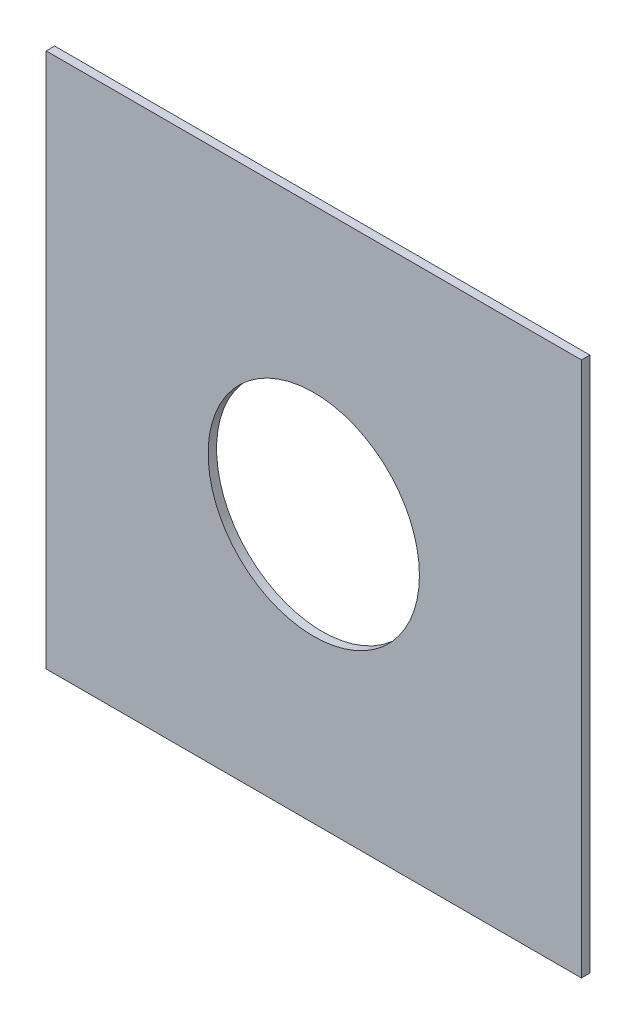
ISO-10303-21;
HEADER;
FILE_DESCRIPTION(('STEP AP214'),'2;1');
FILE_NAME('part.step','',(''),(''),'','','');
FILE_SCHEMA(('AUTOMOTIVE_DESIGN { 1 0 10303 214 1 1 1 1 }'));
ENDSEC;
DATA;
#1=APPLICATION_CONTEXT('core data for automotive mechanical design processes');
#2=APPLICATION_PROTOCOL_DEFINITION('international standard','automotive_design',2000,#1);
#3=PRODUCT_CONTEXT('',#1,'mechanical');
#4=PRODUCT('Part','Part','',(#3));
#5=PRODUCT_RELATED_PRODUCT_CATEGORY('part','',(#4));
#6=PRODUCT_DEFINITION_FORMATION('','',#4);
#7=PRODUCT_DEFINITION_CONTEXT('part definition',#1,'design');
#8=PRODUCT_DEFINITION('design','',#6,#7);
#9=PRODUCT_DEFINITION_SHAPE('','',#8);
#10=(LENGTH_UNIT() NAMED_UNIT(*) SI_UNIT(.MILLI.,.METRE.));
#11=(NAMED_UNIT(*) PLANE_ANGLE_UNIT() SI_UNIT($,.RADIAN.));
#12=(NAMED_UNIT(*) SI_UNIT($,.STERADIAN.) SOLID_ANGLE_UNIT());
#13=UNCERTAINTY_MEASURE_WITH_UNIT(LENGTH_MEASURE(1.E-05),#10,'distance_accuracy_value','');
#14=(GEOMETRIC_REPRESENTATION_CONTEXT(3) GLOBAL_UNCERTAINTY_ASSIGNED_CONTEXT((#13)) GLOBAL_UNIT_ASSIGNED_CONTEXT((#10,
#11,#12)) REPRESENTATION_CONTEXT('',''));
#15=CARTESIAN_POINT('',(0.,0.,0.));
#16=DIRECTION('',(0.,0.,1.));
#17=DIRECTION('',(1.,0.,0.));
#18=AXIS2_PLACEMENT_3D('',#15,#16,#17);
#19=CARTESIAN_POINT('',(95.,-95.,-3.));
#20=DIRECTION('',(1.,0.,0.));
#21=DIRECTION('',(0.,0.,-1.));
#22=AXIS2_PLACEMENT_3D('',#19,#20,#21);
#23=PLANE('',#22);
#24=DIRECTION('',(0.,1.,0.));
#25=VECTOR('',#24,1.);
#26=CARTESIAN_POINT('',(95.,-95.,0.));
#27=LINE('',#26,#25);
#28=CARTESIAN_POINT('',(95.,-95.,0.));
#29=VERTEX_POINT('',#28);
#30=CARTESIAN_POINT('',(95.,95.,0.));
#31=VERTEX_POINT('',#30);
#32=EDGE_CURVE('E102',#29,#31,#27,.T.);
#33=ORIENTED_EDGE('',*,*,#32,.F.);
#34=DIRECTION('',(0.,0.,1.));
#35=VECTOR('',#34,1.);
#36=CARTESIAN_POINT('',(95.,-95.,-3.));
#37=LINE('',#36,#35);
#38=CARTESIAN_POINT('',(95.,-95.,-3.));
#39=VERTEX_POINT('',#38);
#40=EDGE_CURVE('E11',#39,#29,#37,.T.);
#41=ORIENTED_EDGE('',*,*,#40,.F.);
#42=DIRECTION('',(0.,1.,0.));
#43=VECTOR('',#42,1.);
#44=CARTESIAN_POINT('',(95.,-95.,-3.));
#45=LINE('',#44,#43);
#46=CARTESIAN_POINT('',(95.,95.,-3.));
#47=VERTEX_POINT('',#46);
#48=EDGE_CURVE('E95',#39,#47,#45,.T.);
#49=ORIENTED_EDGE('',*,*,#48,.T.);
#50=DIRECTION('',(0.,0.,1.));
#51=VECTOR('',#50,1.);
#52=CARTESIAN_POINT('',(95.,95.,-3.));
#53=LINE('',#52,#51);
#54=EDGE_CURVE('E40',#47,#31,#53,.T.);
#55=ORIENTED_EDGE('',*,*,#54,.T.);
#56=EDGE_LOOP('',(#33,#41,#49,#55));
#57=FACE_BOUND('',#56,.T.);
#58=ADVANCED_FACE('F37',(#57),#23,.T.);
#59=CARTESIAN_POINT('',(-95.,-95.,-3.));
#60=DIRECTION('',(0.,-1.,0.));
#61=DIRECTION('',(0.,0.,-1.));
#62=AXIS2_PLACEMENT_3D('',#59,#60,#61);
#63=PLANE('',#62);
#64=DIRECTION('',(1.,0.,0.));
#65=VECTOR('',#64,1.);
#66=CARTESIAN_POINT('',(-95.,-95.,0.));
#67=LINE('',#66,#65);
#68=CARTESIAN_POINT('',(-95.,-95.,0.));
#69=VERTEX_POINT('',#68);
#70=EDGE_CURVE('E97',#69,#29,#67,.T.);
#71=ORIENTED_EDGE('',*,*,#70,.F.);
#72=DIRECTION('',(0.,0.,1.));
#73=VECTOR('',#72,1.);
#74=CARTESIAN_POINT('',(-95.,-95.,-3.));
#75=LINE('',#74,#73);
#76=CARTESIAN_POINT('',(-95.,-95.,-3.));
#77=VERTEX_POINT('',#76);
#78=EDGE_CURVE('E46',#77,#69,#75,.T.);
#79=ORIENTED_EDGE('',*,*,#78,.F.);
#80=DIRECTION('',(1.,0.,0.));
#81=VECTOR('',#80,1.);
#82=CARTESIAN_POINT('',(-95.,-95.,-3.));
#83=LINE('',#82,#81);
#84=EDGE_CURVE('E92',#77,#39,#83,.T.);
#85=ORIENTED_EDGE('',*,*,#84,.T.);
#86=ORIENTED_EDGE('',*,*,#40,.T.);
#87=EDGE_LOOP('',(#71,#79,#85,#86));
#88=FACE_BOUND('',#87,.T.);
#89=ADVANCED_FACE('F113',(#88),#63,.T.);
#90=CARTESIAN_POINT('',(-95.,-95.,-3.));
#91=DIRECTION('',(-1.,0.,0.));
#92=DIRECTION('',(0.,0.,1.));
#93=AXIS2_PLACEMENT_3D('',#90,#91,#92);
#94=PLANE('',#93);
#95=DIRECTION('',(0.,-1.,0.));
#96=VECTOR('',#95,1.);
#97=CARTESIAN_POINT('',(-95.,-95.,0.));
#98=LINE('',#97,#96);
#99=CARTESIAN_POINT('',(-95.,95.,0.));
#100=VERTEX_POINT('',#99);
#101=EDGE_CURVE('E87',#100,#69,#98,.T.);
#102=ORIENTED_EDGE('',*,*,#101,.F.);
#103=DIRECTION('',(0.,0.,1.));
#104=VECTOR('',#103,1.);
#105=CARTESIAN_POINT('',(-95.,95.,-3.));
#106=LINE('',#105,#104);
#107=CARTESIAN_POINT('',(-95.,95.,-3.));
#108=VERTEX_POINT('',#107);
#109=EDGE_CURVE('E82',#108,#100,#106,.T.);
#110=ORIENTED_EDGE('',*,*,#109,.F.);
#111=DIRECTION('',(0.,-1.,0.));
#112=VECTOR('',#111,1.);
#113=CARTESIAN_POINT('',(-95.,-95.,-3.));
#114=LINE('',#113,#112);
#115=EDGE_CURVE('E85',#108,#77,#114,.T.);
#116=ORIENTED_EDGE('',*,*,#115,.T.);
#117=ORIENTED_EDGE('',*,*,#78,.T.);
#118=EDGE_LOOP('',(#102,#110,#116,#117));
#119=FACE_BOUND('',#118,.T.);
#120=ADVANCED_FACE('F84',(#119),#94,.T.);
#121=CARTESIAN_POINT('',(-95.,95.,-3.));
#122=DIRECTION('',(0.,1.,0.));
#123=DIRECTION('',(0.,0.,1.));
#124=AXIS2_PLACEMENT_3D('',#121,#122,#123);
#125=PLANE('',#124);
#126=DIRECTION('',(-1.,0.,0.));
#127=VECTOR('',#126,1.);
#128=CARTESIAN_POINT('',(-95.,95.,0.));
#129=LINE('',#128,#127);
#130=EDGE_CURVE('E105',#31,#100,#129,.T.);
#131=ORIENTED_EDGE('',*,*,#130,.F.);
#132=ORIENTED_EDGE('',*,*,#54,.F.);
#133=DIRECTION('',(-1.,0.,0.));
#134=VECTOR('',#133,1.);
#135=CARTESIAN_POINT('',(-95.,95.,-3.));
#136=LINE('',#135,#134);
#137=EDGE_CURVE('E91',#47,#108,#136,.T.);
#138=ORIENTED_EDGE('',*,*,#137,.T.);
#139=ORIENTED_EDGE('',*,*,#109,.T.);
#140=EDGE_LOOP('',(#131,#132,#138,#139));
#141=FACE_BOUND('',#140,.T.);
#142=ADVANCED_FACE('F94',(#141),#125,.T.);
#143=CARTESIAN_POINT('',(0.,0.,-3.));
#144=DIRECTION('',(0.,0.,-1.));
#145=DIRECTION('',(-1.,0.,0.));
#146=AXIS2_PLACEMENT_3D('',#143,#144,#145);
#147=PLANE('',#146);
#148=CARTESIAN_POINT('',(6.93889390390723E-13,-5.27355936696949E-13,-3.));
#149=DIRECTION('',(0.,0.,1.));
#150=DIRECTION('',(1.,0.,0.));
#151=AXIS2_PLACEMENT_3D('',#148,#149,#150);
#152=CIRCLE('',#151,37.5);
#153=CARTESIAN_POINT('',(37.5000000000007,-5.27355936696949E-13,-3.));
#154=VERTEX_POINT('',#153);
#155=EDGE_CURVE('E106',#154,#154,#152,.T.);
#156=ORIENTED_EDGE('',*,*,#155,.T.);
#157=EDGE_LOOP('',(#156));
#158=FACE_BOUND('',#157,.T.);
#159=ORIENTED_EDGE('',*,*,#48,.F.);
#160=ORIENTED_EDGE('',*,*,#84,.F.);
#161=ORIENTED_EDGE('',*,*,#115,.F.);
#162=ORIENTED_EDGE('',*,*,#137,.F.);
#163=EDGE_LOOP('',(#159,#160,#161,#162));
#164=FACE_BOUND('',#163,.T.);
#165=ADVANCED_FACE('F90',(#158,#164),#147,.T.);
#166=CARTESIAN_POINT('',(0.,0.,0.));
#167=DIRECTION('',(0.,0.,-1.));
#168=DIRECTION('',(-1.,0.,0.));
#169=AXIS2_PLACEMENT_3D('',#166,#167,#168);
#170=PLANE('',#169);
#171=CARTESIAN_POINT('',(6.93889390390723E-13,-5.27355936696949E-13,0.));
#172=DIRECTION('',(0.,0.,1.));
#173=DIRECTION('',(1.,0.,0.));
#174=AXIS2_PLACEMENT_3D('',#171,#172,#173);
#175=CIRCLE('',#174,37.5);
#176=CARTESIAN_POINT('',(37.5000000000007,-5.27355936696949E-13,0.));
#177=VERTEX_POINT('',#176);
#178=EDGE_CURVE('E143',#177,#177,#175,.T.);
#179=ORIENTED_EDGE('',*,*,#178,.F.);
#180=EDGE_LOOP('',(#179));
#181=FACE_BOUND('',#180,.T.);
#182=ORIENTED_EDGE('',*,*,#32,.T.);
#183=ORIENTED_EDGE('',*,*,#130,.T.);
#184=ORIENTED_EDGE('',*,*,#101,.T.);
#185=ORIENTED_EDGE('',*,*,#70,.T.);
#186=EDGE_LOOP('',(#182,#183,#184,#185));
#187=FACE_BOUND('',#186,.T.);
#188=ADVANCED_FACE('F112',(#181,#187),#170,.F.);
#189=CARTESIAN_POINT('',(6.93889390390723E-13,-5.27355936696949E-13,-3.));
#190=DIRECTION('',(0.,0.,1.));
#191=DIRECTION('',(1.,0.,0.));
#192=AXIS2_PLACEMENT_3D('',#189,#190,#191);
#193=CYLINDRICAL_SURFACE('',#192,37.5);
#194=ORIENTED_EDGE('',*,*,#155,.F.);
#195=EDGE_LOOP('',(#194));
#196=FACE_BOUND('',#195,.T.);
#197=ORIENTED_EDGE('',*,*,#178,.T.);
#198=EDGE_LOOP('',(#197));
#199=FACE_BOUND('',#198,.T.);
#200=ADVANCED_FACE('F131',(#196,#199),#193,.F.);
#201=CLOSED_SHELL('',(#58,#89,#120,#142,#165,#188,#200));
#202=MANIFOLD_SOLID_BREP('B2',#201);
#203=ADVANCED_BREP_SHAPE_REPRESENTATION('',(#18,#202),#14);
#204=SHAPE_DEFINITION_REPRESENTATION(#9,#203);
ENDSEC;
END-ISO-10303-21;
